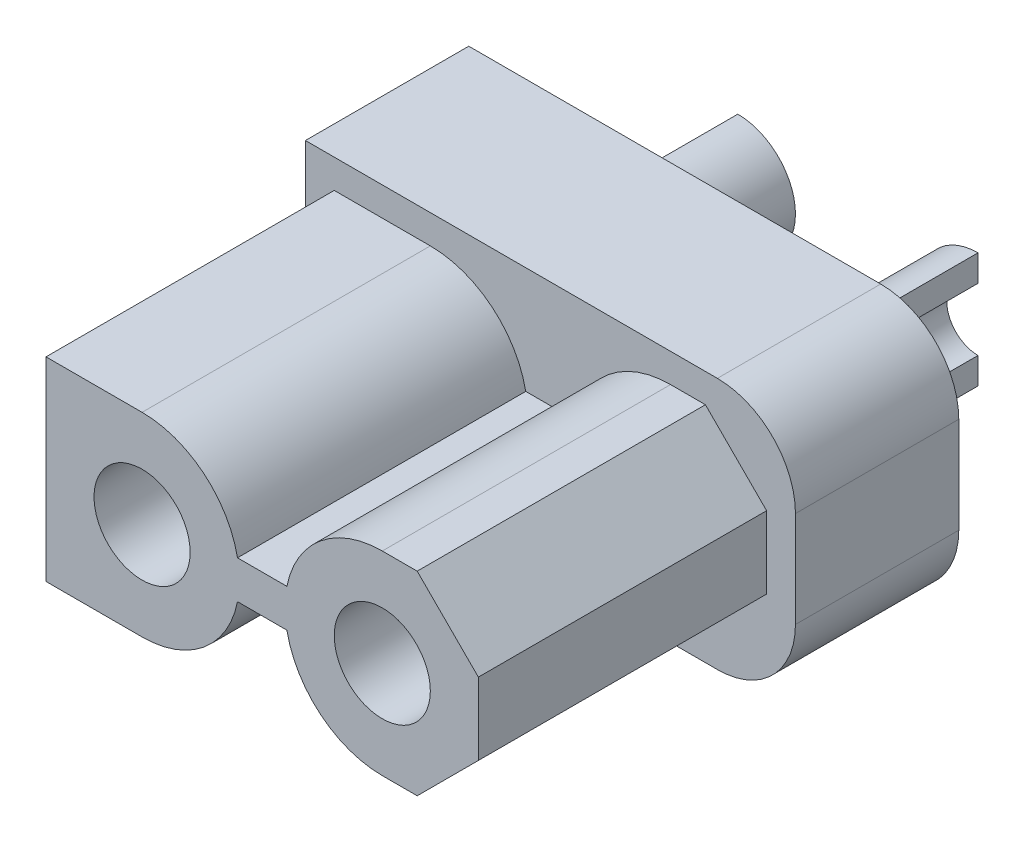
ISO-10303-21;
HEADER;
FILE_DESCRIPTION(('STEP AP214'),'2;1');
FILE_NAME('part.step','',(''),(''),'','','');
FILE_SCHEMA(('AUTOMOTIVE_DESIGN { 1 0 10303 214 1 1 1 1 }'));
ENDSEC;
DATA;
#1=APPLICATION_CONTEXT('core data for automotive mechanical design processes');
#2=APPLICATION_PROTOCOL_DEFINITION('international standard','automotive_design',2000,#1);
#3=PRODUCT_CONTEXT('',#1,'mechanical');
#4=PRODUCT('Part','Part','',(#3));
#5=PRODUCT_RELATED_PRODUCT_CATEGORY('part','',(#4));
#6=PRODUCT_DEFINITION_FORMATION('','',#4);
#7=PRODUCT_DEFINITION_CONTEXT('part definition',#1,'design');
#8=PRODUCT_DEFINITION('design','',#6,#7);
#9=PRODUCT_DEFINITION_SHAPE('','',#8);
#10=(LENGTH_UNIT() NAMED_UNIT(*) SI_UNIT(.MILLI.,.METRE.));
#11=(NAMED_UNIT(*) PLANE_ANGLE_UNIT() SI_UNIT($,.RADIAN.));
#12=(NAMED_UNIT(*) SI_UNIT($,.STERADIAN.) SOLID_ANGLE_UNIT());
#13=UNCERTAINTY_MEASURE_WITH_UNIT(LENGTH_MEASURE(1.E-05),#10,'distance_accuracy_value','');
#14=(GEOMETRIC_REPRESENTATION_CONTEXT(3) GLOBAL_UNCERTAINTY_ASSIGNED_CONTEXT((#13)) GLOBAL_UNIT_ASSIGNED_CONTEXT((#10,
#11,#12)) REPRESENTATION_CONTEXT('',''));
#15=CARTESIAN_POINT('',(0.,0.,0.));
#16=DIRECTION('',(0.,0.,1.));
#17=DIRECTION('',(1.,0.,0.));
#18=AXIS2_PLACEMENT_3D('',#15,#16,#17);
#19=CARTESIAN_POINT('',(2.6,0.,-9.39411254969543));
#20=DIRECTION('',(0.,0.,1.));
#21=DIRECTION('',(1.,0.,0.));
#22=AXIS2_PLACEMENT_3D('',#19,#20,#21);
#23=CYLINDRICAL_SURFACE('',#22,1.2);
#24=CARTESIAN_POINT('',(2.6,0.,0.));
#25=DIRECTION('',(0.,0.,1.));
#26=DIRECTION('',(1.,0.,0.));
#27=AXIS2_PLACEMENT_3D('',#24,#25,#26);
#28=CIRCLE('',#27,1.2);
#29=CARTESIAN_POINT('',(3.8,0.,0.));
#30=VERTEX_POINT('',#29);
#31=EDGE_CURVE('E373',#30,#30,#28,.T.);
#32=ORIENTED_EDGE('',*,*,#31,.F.);
#33=EDGE_LOOP('',(#32));
#34=FACE_BOUND('',#33,.T.);
#35=CARTESIAN_POINT('',(2.6,0.,-0.66));
#36=DIRECTION('',(0.,0.,-1.));
#37=DIRECTION('',(-1.,0.,0.));
#38=AXIS2_PLACEMENT_3D('',#35,#36,#37);
#39=CIRCLE('',#38,1.2);
#40=CARTESIAN_POINT('',(2.6,-1.2,-0.66));
#41=VERTEX_POINT('',#40);
#42=CARTESIAN_POINT('',(2.6,1.2,-0.66));
#43=VERTEX_POINT('',#42);
#44=EDGE_CURVE('E312',#41,#43,#39,.T.);
#45=ORIENTED_EDGE('',*,*,#44,.F.);
#46=DIRECTION('',(0.,0.,-1.));
#47=VECTOR('',#46,1.);
#48=CARTESIAN_POINT('',(2.6,-1.2,-0.66));
#49=LINE('',#48,#47);
#50=CARTESIAN_POINT('',(2.6,-1.2,-3.));
#51=VERTEX_POINT('',#50);
#52=EDGE_CURVE('E297',#41,#51,#49,.T.);
#53=ORIENTED_EDGE('',*,*,#52,.T.);
#54=CARTESIAN_POINT('',(2.6,0.,-3.));
#55=DIRECTION('',(0.,0.,1.));
#56=DIRECTION('',(1.,0.,0.));
#57=AXIS2_PLACEMENT_3D('',#54,#55,#56);
#58=CIRCLE('',#57,1.2);
#59=CARTESIAN_POINT('',(2.6,1.2,-3.));
#60=VERTEX_POINT('',#59);
#61=EDGE_CURVE('E364',#60,#51,#58,.F.);
#62=ORIENTED_EDGE('',*,*,#61,.F.);
#63=DIRECTION('',(0.,0.,-1.));
#64=VECTOR('',#63,1.);
#65=CARTESIAN_POINT('',(2.6,1.2,-0.66));
#66=LINE('',#65,#64);
#67=EDGE_CURVE('E308',#43,#60,#66,.T.);
#68=ORIENTED_EDGE('',*,*,#67,.F.);
#69=EDGE_LOOP('',(#45,#53,#62,#68));
#70=FACE_BOUND('',#69,.T.);
#71=ADVANCED_FACE('F111',(#34,#70),#23,.T.);
#72=CARTESIAN_POINT('',(0.,0.,-3.));
#73=DIRECTION('',(0.,0.,1.));
#74=DIRECTION('',(1.,0.,0.));
#75=AXIS2_PLACEMENT_3D('',#72,#73,#74);
#76=PLANE('',#75);
#77=DIRECTION('',(0.,1.,0.));
#78=VECTOR('',#77,1.);
#79=CARTESIAN_POINT('',(2.6,0.,-3.));
#80=LINE('',#79,#78);
#81=CARTESIAN_POINT('',(2.6,-0.65,-3.));
#82=VERTEX_POINT('',#81);
#83=EDGE_CURVE('E302',#51,#82,#80,.T.);
#84=ORIENTED_EDGE('',*,*,#83,.T.);
#85=CARTESIAN_POINT('',(2.6,0.,-3.));
#86=DIRECTION('',(0.,0.,-1.));
#87=DIRECTION('',(-1.,0.,0.));
#88=AXIS2_PLACEMENT_3D('',#85,#86,#87);
#89=CIRCLE('',#88,0.65);
#90=CARTESIAN_POINT('',(2.6,0.65,-3.));
#91=VERTEX_POINT('',#90);
#92=EDGE_CURVE('E332',#91,#82,#89,.T.);
#93=ORIENTED_EDGE('',*,*,#92,.F.);
#94=EDGE_CURVE('E317',#91,#60,#80,.T.);
#95=ORIENTED_EDGE('',*,*,#94,.T.);
#96=ORIENTED_EDGE('',*,*,#61,.T.);
#97=EDGE_LOOP('',(#84,#93,#95,#96));
#98=FACE_BOUND('',#97,.T.);
#99=ADVANCED_FACE('F670',(#98),#76,.F.);
#100=CARTESIAN_POINT('',(2.6,0.,1.83847763108502));
#101=DIRECTION('',(0.,0.,-1.));
#102=DIRECTION('',(-1.,0.,0.));
#103=AXIS2_PLACEMENT_3D('',#100,#101,#102);
#104=CYLINDRICAL_SURFACE('',#103,0.65);
#105=CARTESIAN_POINT('',(2.6,0.,0.));
#106=DIRECTION('',(0.,0.,1.));
#107=DIRECTION('',(1.,0.,0.));
#108=AXIS2_PLACEMENT_3D('',#105,#106,#107);
#109=CIRCLE('',#108,0.65);
#110=CARTESIAN_POINT('',(3.25,0.,0.));
#111=VERTEX_POINT('',#110);
#112=EDGE_CURVE('E360',#111,#111,#109,.F.);
#113=ORIENTED_EDGE('',*,*,#112,.F.);
#114=EDGE_LOOP('',(#113));
#115=FACE_BOUND('',#114,.T.);
#116=DIRECTION('',(0.,0.,-1.));
#117=VECTOR('',#116,1.);
#118=CARTESIAN_POINT('',(2.6,-0.65,-0.66));
#119=LINE('',#118,#117);
#120=CARTESIAN_POINT('',(2.6,-0.65,-0.66));
#121=VERTEX_POINT('',#120);
#122=EDGE_CURVE('E329',#121,#82,#119,.T.);
#123=ORIENTED_EDGE('',*,*,#122,.F.);
#124=CARTESIAN_POINT('',(2.6,0.,-0.66));
#125=DIRECTION('',(0.,0.,-1.));
#126=DIRECTION('',(-1.,0.,0.));
#127=AXIS2_PLACEMENT_3D('',#124,#125,#126);
#128=CIRCLE('',#127,0.65);
#129=CARTESIAN_POINT('',(2.6,0.65,-0.66));
#130=VERTEX_POINT('',#129);
#131=EDGE_CURVE('E309',#130,#121,#128,.F.);
#132=ORIENTED_EDGE('',*,*,#131,.F.);
#133=DIRECTION('',(0.,0.,-1.));
#134=VECTOR('',#133,1.);
#135=CARTESIAN_POINT('',(2.6,0.65,-0.66));
#136=LINE('',#135,#134);
#137=EDGE_CURVE('E333',#130,#91,#136,.T.);
#138=ORIENTED_EDGE('',*,*,#137,.T.);
#139=ORIENTED_EDGE('',*,*,#92,.T.);
#140=EDGE_LOOP('',(#123,#132,#138,#139));
#141=FACE_BOUND('',#140,.T.);
#142=ADVANCED_FACE('F676',(#115,#141),#104,.F.);
#143=CARTESIAN_POINT('',(0.,-2.625,3.4));
#144=DIRECTION('',(0.,1.,0.));
#145=DIRECTION('',(-1.,0.,0.));
#146=AXIS2_PLACEMENT_3D('',#143,#144,#145);
#147=PLANE('',#146);
#148=DIRECTION('',(1.,0.,0.));
#149=VECTOR('',#148,1.);
#150=CARTESIAN_POINT('',(0.,-2.625,0.));
#151=LINE('',#150,#149);
#152=CARTESIAN_POINT('',(0.,-2.625,0.));
#153=VERTEX_POINT('',#152);
#154=CARTESIAN_POINT('',(8.575,-2.625,0.));
#155=VERTEX_POINT('',#154);
#156=EDGE_CURVE('E447',#153,#155,#151,.T.);
#157=ORIENTED_EDGE('',*,*,#156,.T.);
#158=DIRECTION('',(0.,0.,-1.));
#159=VECTOR('',#158,1.);
#160=CARTESIAN_POINT('',(8.575,-2.625,3.4));
#161=LINE('',#160,#159);
#162=CARTESIAN_POINT('',(8.575,-2.625,3.4));
#163=VERTEX_POINT('',#162);
#164=EDGE_CURVE('E559',#163,#155,#161,.T.);
#165=ORIENTED_EDGE('',*,*,#164,.F.);
#166=DIRECTION('',(1.,0.,0.));
#167=VECTOR('',#166,1.);
#168=CARTESIAN_POINT('',(0.,-2.625,3.4));
#169=LINE('',#168,#167);
#170=CARTESIAN_POINT('',(0.,-2.625,3.4));
#171=VERTEX_POINT('',#170);
#172=EDGE_CURVE('E498',#171,#163,#169,.T.);
#173=ORIENTED_EDGE('',*,*,#172,.F.);
#174=DIRECTION('',(0.,0.,-1.));
#175=VECTOR('',#174,1.);
#176=CARTESIAN_POINT('',(0.,-2.625,3.4));
#177=LINE('',#176,#175);
#178=EDGE_CURVE('E522',#171,#153,#177,.T.);
#179=ORIENTED_EDGE('',*,*,#178,.T.);
#180=EDGE_LOOP('',(#157,#165,#173,#179));
#181=FACE_BOUND('',#180,.T.);
#182=ADVANCED_FACE('F113',(#181),#147,.F.);
#183=CARTESIAN_POINT('',(8.575,-1.,3.4));
#184=DIRECTION('',(0.,0.,-1.));
#185=DIRECTION('',(-1.,0.,0.));
#186=AXIS2_PLACEMENT_3D('',#183,#184,#185);
#187=CYLINDRICAL_SURFACE('',#186,1.62499999999999);
#188=CARTESIAN_POINT('',(8.575,-1.,0.));
#189=DIRECTION('',(0.,0.,1.));
#190=DIRECTION('',(1.,0.,0.));
#191=AXIS2_PLACEMENT_3D('',#188,#189,#190);
#192=CIRCLE('',#191,1.62499999999999);
#193=CARTESIAN_POINT('',(10.2,-1.,0.));
#194=VERTEX_POINT('',#193);
#195=EDGE_CURVE('E526',#155,#194,#192,.T.);
#196=ORIENTED_EDGE('',*,*,#195,.T.);
#197=DIRECTION('',(0.,0.,-1.));
#198=VECTOR('',#197,1.);
#199=CARTESIAN_POINT('',(10.2,-1.,3.4));
#200=LINE('',#199,#198);
#201=CARTESIAN_POINT('',(10.2,-1.,3.4));
#202=VERTEX_POINT('',#201);
#203=EDGE_CURVE('E556',#202,#194,#200,.T.);
#204=ORIENTED_EDGE('',*,*,#203,.F.);
#205=CARTESIAN_POINT('',(8.575,-1.,3.4));
#206=DIRECTION('',(0.,0.,1.));
#207=DIRECTION('',(1.,0.,0.));
#208=AXIS2_PLACEMENT_3D('',#205,#206,#207);
#209=CIRCLE('',#208,1.62499999999999);
#210=EDGE_CURVE('E502',#163,#202,#209,.T.);
#211=ORIENTED_EDGE('',*,*,#210,.F.);
#212=ORIENTED_EDGE('',*,*,#164,.T.);
#213=EDGE_LOOP('',(#196,#204,#211,#212));
#214=FACE_BOUND('',#213,.T.);
#215=ADVANCED_FACE('F765',(#214),#187,.T.);
#216=CARTESIAN_POINT('',(10.2,0.,3.4));
#217=DIRECTION('',(1.,0.,0.));
#218=DIRECTION('',(0.,0.,-1.));
#219=AXIS2_PLACEMENT_3D('',#216,#217,#218);
#220=PLANE('',#219);
#221=DIRECTION('',(0.,-1.,0.));
#222=VECTOR('',#221,1.);
#223=CARTESIAN_POINT('',(10.2,0.,0.));
#224=LINE('',#223,#222);
#225=CARTESIAN_POINT('',(10.2,1.,0.));
#226=VERTEX_POINT('',#225);
#227=EDGE_CURVE('E530',#226,#194,#224,.T.);
#228=ORIENTED_EDGE('',*,*,#227,.F.);
#229=DIRECTION('',(0.,0.,-1.));
#230=VECTOR('',#229,1.);
#231=CARTESIAN_POINT('',(10.2,1.,3.4));
#232=LINE('',#231,#230);
#233=CARTESIAN_POINT('',(10.2,1.,3.4));
#234=VERTEX_POINT('',#233);
#235=EDGE_CURVE('E553',#234,#226,#232,.T.);
#236=ORIENTED_EDGE('',*,*,#235,.F.);
#237=DIRECTION('',(0.,-1.,0.));
#238=VECTOR('',#237,1.);
#239=CARTESIAN_POINT('',(10.2,0.,3.4));
#240=LINE('',#239,#238);
#241=EDGE_CURVE('E506',#234,#202,#240,.T.);
#242=ORIENTED_EDGE('',*,*,#241,.T.);
#243=ORIENTED_EDGE('',*,*,#203,.T.);
#244=EDGE_LOOP('',(#228,#236,#242,#243));
#245=FACE_BOUND('',#244,.T.);
#246=ADVANCED_FACE('F762',(#245),#220,.T.);
#247=CARTESIAN_POINT('',(8.575,1.,3.4));
#248=DIRECTION('',(0.,0.,-1.));
#249=DIRECTION('',(-1.,0.,0.));
#250=AXIS2_PLACEMENT_3D('',#247,#248,#249);
#251=CYLINDRICAL_SURFACE('',#250,1.62499999999999);
#252=CARTESIAN_POINT('',(8.575,1.,0.));
#253=DIRECTION('',(0.,0.,1.));
#254=DIRECTION('',(1.,0.,0.));
#255=AXIS2_PLACEMENT_3D('',#252,#253,#254);
#256=CIRCLE('',#255,1.62499999999999);
#257=CARTESIAN_POINT('',(8.575,2.625,0.));
#258=VERTEX_POINT('',#257);
#259=EDGE_CURVE('E534',#258,#226,#256,.F.);
#260=ORIENTED_EDGE('',*,*,#259,.F.);
#261=DIRECTION('',(0.,0.,-1.));
#262=VECTOR('',#261,1.);
#263=CARTESIAN_POINT('',(8.575,2.625,3.4));
#264=LINE('',#263,#262);
#265=CARTESIAN_POINT('',(8.575,2.625,3.4));
#266=VERTEX_POINT('',#265);
#267=EDGE_CURVE('E550',#266,#258,#264,.T.);
#268=ORIENTED_EDGE('',*,*,#267,.F.);
#269=CARTESIAN_POINT('',(8.575,1.,3.4));
#270=DIRECTION('',(0.,0.,1.));
#271=DIRECTION('',(1.,0.,0.));
#272=AXIS2_PLACEMENT_3D('',#269,#270,#271);
#273=CIRCLE('',#272,1.62499999999999);
#274=EDGE_CURVE('E510',#266,#234,#273,.F.);
#275=ORIENTED_EDGE('',*,*,#274,.T.);
#276=ORIENTED_EDGE('',*,*,#235,.T.);
#277=EDGE_LOOP('',(#260,#268,#275,#276));
#278=FACE_BOUND('',#277,.T.);
#279=ADVANCED_FACE('F758',(#278),#251,.T.);
#280=CARTESIAN_POINT('',(0.,2.625,3.4));
#281=DIRECTION('',(0.,1.,0.));
#282=DIRECTION('',(-1.,0.,0.));
#283=AXIS2_PLACEMENT_3D('',#280,#281,#282);
#284=PLANE('',#283);
#285=DIRECTION('',(1.,0.,0.));
#286=VECTOR('',#285,1.);
#287=CARTESIAN_POINT('',(0.,2.625,0.));
#288=LINE('',#287,#286);
#289=CARTESIAN_POINT('',(0.,2.625,0.));
#290=VERTEX_POINT('',#289);
#291=EDGE_CURVE('E538',#290,#258,#288,.T.);
#292=ORIENTED_EDGE('',*,*,#291,.F.);
#293=DIRECTION('',(0.,0.,-1.));
#294=VECTOR('',#293,1.);
#295=CARTESIAN_POINT('',(0.,2.625,3.4));
#296=LINE('',#295,#294);
#297=CARTESIAN_POINT('',(0.,2.625,3.4));
#298=VERTEX_POINT('',#297);
#299=EDGE_CURVE('E547',#298,#290,#296,.T.);
#300=ORIENTED_EDGE('',*,*,#299,.F.);
#301=DIRECTION('',(1.,0.,0.));
#302=VECTOR('',#301,1.);
#303=CARTESIAN_POINT('',(0.,2.625,3.4));
#304=LINE('',#303,#302);
#305=EDGE_CURVE('E514',#298,#266,#304,.T.);
#306=ORIENTED_EDGE('',*,*,#305,.T.);
#307=ORIENTED_EDGE('',*,*,#267,.T.);
#308=EDGE_LOOP('',(#292,#300,#306,#307));
#309=FACE_BOUND('',#308,.T.);
#310=ADVANCED_FACE('F754',(#309),#284,.T.);
#311=CARTESIAN_POINT('',(0.,0.,3.4));
#312=DIRECTION('',(-1.,0.,0.));
#313=DIRECTION('',(0.,0.,1.));
#314=AXIS2_PLACEMENT_3D('',#311,#312,#313);
#315=PLANE('',#314);
#316=DIRECTION('',(0.,1.,0.));
#317=VECTOR('',#316,1.);
#318=CARTESIAN_POINT('',(0.,0.,0.));
#319=LINE('',#318,#317);
#320=EDGE_CURVE('E503',#153,#290,#319,.T.);
#321=ORIENTED_EDGE('',*,*,#320,.F.);
#322=ORIENTED_EDGE('',*,*,#178,.F.);
#323=DIRECTION('',(0.,1.,0.));
#324=VECTOR('',#323,1.);
#325=CARTESIAN_POINT('',(0.,0.,3.4));
#326=LINE('',#325,#324);
#327=EDGE_CURVE('E518',#171,#298,#326,.T.);
#328=ORIENTED_EDGE('',*,*,#327,.T.);
#329=ORIENTED_EDGE('',*,*,#299,.T.);
#330=EDGE_LOOP('',(#321,#322,#328,#329));
#331=FACE_BOUND('',#330,.T.);
#332=ADVANCED_FACE('F747',(#331),#315,.T.);
#333=CARTESIAN_POINT('',(0.,0.,3.4));
#334=DIRECTION('',(0.,0.,1.));
#335=DIRECTION('',(1.,0.,0.));
#336=AXIS2_PLACEMENT_3D('',#333,#334,#335);
#337=PLANE('',#336);
#338=DIRECTION('',(-0.707106781186547,0.707106781186549,0.));
#339=VECTOR('',#338,1.);
#340=CARTESIAN_POINT('',(5.17573593128809,5.17573593128807,3.4));
#341=LINE('',#340,#339);
#342=CARTESIAN_POINT('',(9.6,0.751471862576143,3.4));
#343=VERTEX_POINT('',#342);
#344=CARTESIAN_POINT('',(8.32647186257615,2.025,3.4));
#345=VERTEX_POINT('',#344);
#346=EDGE_CURVE('E614',#343,#345,#341,.T.);
#347=ORIENTED_EDGE('',*,*,#346,.F.);
#348=DIRECTION('',(0.,1.,0.));
#349=VECTOR('',#348,1.);
#350=CARTESIAN_POINT('',(9.6,0.,3.4));
#351=LINE('',#350,#349);
#352=CARTESIAN_POINT('',(9.6,-0.751471862576143,3.4));
#353=VERTEX_POINT('',#352);
#354=EDGE_CURVE('E599',#353,#343,#351,.T.);
#355=ORIENTED_EDGE('',*,*,#354,.F.);
#356=DIRECTION('',(0.707106781186546,0.707106781186549,0.));
#357=VECTOR('',#356,1.);
#358=CARTESIAN_POINT('',(5.17573593128809,-5.17573593128807,3.4));
#359=LINE('',#358,#357);
#360=CARTESIAN_POINT('',(8.32647186257615,-2.025,3.4));
#361=VERTEX_POINT('',#360);
#362=EDGE_CURVE('E591',#361,#353,#359,.T.);
#363=ORIENTED_EDGE('',*,*,#362,.F.);
#364=DIRECTION('',(1.,0.,0.));
#365=VECTOR('',#364,1.);
#366=CARTESIAN_POINT('',(0.,-2.025,3.4));
#367=LINE('',#366,#365);
#368=CARTESIAN_POINT('',(7.6,-2.025,3.4));
#369=VERTEX_POINT('',#368);
#370=EDGE_CURVE('E587',#369,#361,#367,.T.);
#371=ORIENTED_EDGE('',*,*,#370,.F.);
#372=CARTESIAN_POINT('',(7.6,0.,3.4));
#373=DIRECTION('',(0.,0.,1.));
#374=DIRECTION('',(1.,0.,0.));
#375=AXIS2_PLACEMENT_3D('',#372,#373,#374);
#376=CIRCLE('',#375,2.025);
#377=CARTESIAN_POINT('',(5.61389829062054,-0.395,3.4));
#378=VERTEX_POINT('',#377);
#379=EDGE_CURVE('E583',#378,#369,#376,.T.);
#380=ORIENTED_EDGE('',*,*,#379,.F.);
#381=DIRECTION('',(1.,0.,0.));
#382=VECTOR('',#381,1.);
#383=CARTESIAN_POINT('',(0.,-0.395,3.4));
#384=LINE('',#383,#382);
#385=CARTESIAN_POINT('',(4.58610170937946,-0.395,3.4));
#386=VERTEX_POINT('',#385);
#387=EDGE_CURVE('E563',#386,#378,#384,.T.);
#388=ORIENTED_EDGE('',*,*,#387,.F.);
#389=CARTESIAN_POINT('',(2.6,0.,3.4));
#390=DIRECTION('',(0.,0.,1.));
#391=DIRECTION('',(1.,0.,0.));
#392=AXIS2_PLACEMENT_3D('',#389,#390,#391);
#393=CIRCLE('',#392,2.025);
#394=CARTESIAN_POINT('',(2.6,-2.025,3.4));
#395=VERTEX_POINT('',#394);
#396=EDGE_CURVE('E567',#395,#386,#393,.T.);
#397=ORIENTED_EDGE('',*,*,#396,.F.);
#398=DIRECTION('',(1.,0.,0.));
#399=VECTOR('',#398,1.);
#400=CARTESIAN_POINT('',(0.,-2.025,3.4));
#401=LINE('',#400,#399);
#402=CARTESIAN_POINT('',(0.6,-2.025,3.4));
#403=VERTEX_POINT('',#402);
#404=EDGE_CURVE('E571',#403,#395,#401,.T.);
#405=ORIENTED_EDGE('',*,*,#404,.F.);
#406=DIRECTION('',(0.,-1.,0.));
#407=VECTOR('',#406,1.);
#408=CARTESIAN_POINT('',(0.6,0.,3.4));
#409=LINE('',#408,#407);
#410=CARTESIAN_POINT('',(0.6,2.025,3.4));
#411=VERTEX_POINT('',#410);
#412=EDGE_CURVE('E575',#411,#403,#409,.T.);
#413=ORIENTED_EDGE('',*,*,#412,.F.);
#414=DIRECTION('',(-1.,0.,0.));
#415=VECTOR('',#414,1.);
#416=CARTESIAN_POINT('',(0.,2.025,3.4));
#417=LINE('',#416,#415);
#418=CARTESIAN_POINT('',(2.6,2.025,3.4));
#419=VERTEX_POINT('',#418);
#420=EDGE_CURVE('E579',#419,#411,#417,.T.);
#421=ORIENTED_EDGE('',*,*,#420,.F.);
#422=CARTESIAN_POINT('',(2.6,0.,3.4));
#423=DIRECTION('',(0.,0.,1.));
#424=DIRECTION('',(1.,0.,0.));
#425=AXIS2_PLACEMENT_3D('',#422,#423,#424);
#426=CIRCLE('',#425,2.025);
#427=CARTESIAN_POINT('',(4.58610170937946,0.395,3.4));
#428=VERTEX_POINT('',#427);
#429=EDGE_CURVE('E595',#428,#419,#426,.T.);
#430=ORIENTED_EDGE('',*,*,#429,.F.);
#431=DIRECTION('',(1.,0.,0.));
#432=VECTOR('',#431,1.);
#433=CARTESIAN_POINT('',(0.,0.395,3.4));
#434=LINE('',#433,#432);
#435=CARTESIAN_POINT('',(5.61389829062054,0.395,3.4));
#436=VERTEX_POINT('',#435);
#437=EDGE_CURVE('E603',#428,#436,#434,.T.);
#438=ORIENTED_EDGE('',*,*,#437,.T.);
#439=CARTESIAN_POINT('',(7.6,0.,3.4));
#440=DIRECTION('',(0.,0.,1.));
#441=DIRECTION('',(1.,0.,0.));
#442=AXIS2_PLACEMENT_3D('',#439,#440,#441);
#443=CIRCLE('',#442,2.025);
#444=CARTESIAN_POINT('',(7.6,2.025,3.4));
#445=VERTEX_POINT('',#444);
#446=EDGE_CURVE('E606',#445,#436,#443,.T.);
#447=ORIENTED_EDGE('',*,*,#446,.F.);
#448=DIRECTION('',(-1.,0.,0.));
#449=VECTOR('',#448,1.);
#450=CARTESIAN_POINT('',(0.,2.025,3.4));
#451=LINE('',#450,#449);
#452=EDGE_CURVE('E610',#345,#445,#451,.T.);
#453=ORIENTED_EDGE('',*,*,#452,.F.);
#454=EDGE_LOOP('',(#347,#355,#363,#371,#380,#388,#397,#405,#413,#421,#430,#438,#447,#453));
#455=FACE_BOUND('',#454,.T.);
#456=ORIENTED_EDGE('',*,*,#172,.T.);
#457=ORIENTED_EDGE('',*,*,#210,.T.);
#458=ORIENTED_EDGE('',*,*,#241,.F.);
#459=ORIENTED_EDGE('',*,*,#274,.F.);
#460=ORIENTED_EDGE('',*,*,#305,.F.);
#461=ORIENTED_EDGE('',*,*,#327,.F.);
#462=EDGE_LOOP('',(#456,#457,#458,#459,#460,#461));
#463=FACE_BOUND('',#462,.T.);
#464=ADVANCED_FACE('F744',(#455,#463),#337,.T.);
#465=CARTESIAN_POINT('',(0.,0.,0.));
#466=DIRECTION('',(0.,0.,1.));
#467=DIRECTION('',(1.,0.,0.));
#468=AXIS2_PLACEMENT_3D('',#465,#466,#467);
#469=PLANE('',#468);
#470=ORIENTED_EDGE('',*,*,#31,.T.);
#471=EDGE_LOOP('',(#470));
#472=FACE_BOUND('',#471,.T.);
#473=CARTESIAN_POINT('',(7.6,0.,0.));
#474=DIRECTION('',(0.,0.,1.));
#475=DIRECTION('',(1.,0.,0.));
#476=AXIS2_PLACEMENT_3D('',#473,#474,#475);
#477=CIRCLE('',#476,1.2);
#478=CARTESIAN_POINT('',(8.8,0.,0.));
#479=VERTEX_POINT('',#478);
#480=EDGE_CURVE('E381',#479,#479,#477,.T.);
#481=ORIENTED_EDGE('',*,*,#480,.T.);
#482=EDGE_LOOP('',(#481));
#483=FACE_BOUND('',#482,.T.);
#484=ORIENTED_EDGE('',*,*,#156,.F.);
#485=ORIENTED_EDGE('',*,*,#320,.T.);
#486=ORIENTED_EDGE('',*,*,#291,.T.);
#487=ORIENTED_EDGE('',*,*,#259,.T.);
#488=ORIENTED_EDGE('',*,*,#227,.T.);
#489=ORIENTED_EDGE('',*,*,#195,.F.);
#490=EDGE_LOOP('',(#484,#485,#486,#487,#488,#489));
#491=FACE_BOUND('',#490,.T.);
#492=ADVANCED_FACE('F707',(#472,#483,#491),#469,.F.);
#493=CARTESIAN_POINT('',(5.17573593128809,-5.17573593128807,24.4825616439699));
#494=DIRECTION('',(0.707106781186549,-0.707106781186546,0.));
#495=DIRECTION('',(0.707106781186546,0.707106781186549,0.));
#496=AXIS2_PLACEMENT_3D('',#493,#494,#495);
#497=PLANE('',#496);
#498=DIRECTION('',(0.,0.,-1.));
#499=VECTOR('',#498,1.);
#500=CARTESIAN_POINT('',(8.32647186257615,-2.025,24.4825616439699));
#501=LINE('',#500,#499);
#502=CARTESIAN_POINT('',(8.32647186257615,-2.025,9.4));
#503=VERTEX_POINT('',#502);
#504=EDGE_CURVE('E402',#503,#361,#501,.T.);
#505=ORIENTED_EDGE('',*,*,#504,.T.);
#506=ORIENTED_EDGE('',*,*,#362,.T.);
#507=DIRECTION('',(0.,0.,-1.));
#508=VECTOR('',#507,1.);
#509=CARTESIAN_POINT('',(9.6,-0.751471862576144,24.4825616439699));
#510=LINE('',#509,#508);
#511=CARTESIAN_POINT('',(9.6,-0.751471862576144,9.4));
#512=VERTEX_POINT('',#511);
#513=EDGE_CURVE('E407',#512,#353,#510,.T.);
#514=ORIENTED_EDGE('',*,*,#513,.F.);
#515=DIRECTION('',(-0.707106781186546,-0.707106781186549,0.));
#516=VECTOR('',#515,1.);
#517=CARTESIAN_POINT('',(5.17573593128809,-5.17573593128807,9.4));
#518=LINE('',#517,#516);
#519=EDGE_CURVE('E403',#512,#503,#518,.T.);
#520=ORIENTED_EDGE('',*,*,#519,.T.);
#521=EDGE_LOOP('',(#505,#506,#514,#520));
#522=FACE_BOUND('',#521,.T.);
#523=ADVANCED_FACE('F703',(#522),#497,.T.);
#524=CARTESIAN_POINT('',(9.6,0.,24.4825616439699));
#525=DIRECTION('',(1.,0.,0.));
#526=DIRECTION('',(0.,0.,-1.));
#527=AXIS2_PLACEMENT_3D('',#524,#525,#526);
#528=PLANE('',#527);
#529=ORIENTED_EDGE('',*,*,#513,.T.);
#530=ORIENTED_EDGE('',*,*,#354,.T.);
#531=DIRECTION('',(0.,0.,-1.));
#532=VECTOR('',#531,1.);
#533=CARTESIAN_POINT('',(9.6,0.751471862576143,24.4825616439699));
#534=LINE('',#533,#532);
#535=CARTESIAN_POINT('',(9.6,0.751471862576145,9.4));
#536=VERTEX_POINT('',#535);
#537=EDGE_CURVE('E412',#536,#343,#534,.T.);
#538=ORIENTED_EDGE('',*,*,#537,.F.);
#539=DIRECTION('',(0.,-1.,0.));
#540=VECTOR('',#539,1.);
#541=CARTESIAN_POINT('',(9.6,0.,9.4));
#542=LINE('',#541,#540);
#543=EDGE_CURVE('E408',#536,#512,#542,.T.);
#544=ORIENTED_EDGE('',*,*,#543,.T.);
#545=EDGE_LOOP('',(#529,#530,#538,#544));
#546=FACE_BOUND('',#545,.T.);
#547=ADVANCED_FACE('F706',(#546),#528,.T.);
#548=CARTESIAN_POINT('',(5.17573593128809,5.17573593128807,24.4825616439699));
#549=DIRECTION('',(0.707106781186549,0.707106781186547,0.));
#550=DIRECTION('',(-0.707106781186547,0.707106781186549,0.));
#551=AXIS2_PLACEMENT_3D('',#548,#549,#550);
#552=PLANE('',#551);
#553=ORIENTED_EDGE('',*,*,#537,.T.);
#554=ORIENTED_EDGE('',*,*,#346,.T.);
#555=DIRECTION('',(0.,0.,-1.));
#556=VECTOR('',#555,1.);
#557=CARTESIAN_POINT('',(8.32647186257615,2.025,24.4825616439699));
#558=LINE('',#557,#556);
#559=CARTESIAN_POINT('',(8.32647186257615,2.025,9.4));
#560=VERTEX_POINT('',#559);
#561=EDGE_CURVE('E417',#560,#345,#558,.T.);
#562=ORIENTED_EDGE('',*,*,#561,.F.);
#563=DIRECTION('',(0.707106781186547,-0.707106781186549,0.));
#564=VECTOR('',#563,1.);
#565=CARTESIAN_POINT('',(5.17573593128809,5.17573593128807,9.4));
#566=LINE('',#565,#564);
#567=EDGE_CURVE('E413',#560,#536,#566,.T.);
#568=ORIENTED_EDGE('',*,*,#567,.T.);
#569=EDGE_LOOP('',(#553,#554,#562,#568));
#570=FACE_BOUND('',#569,.T.);
#571=ADVANCED_FACE('F711',(#570),#552,.T.);
#572=CARTESIAN_POINT('',(0.,2.025,24.4825616439699));
#573=DIRECTION('',(0.,1.,0.));
#574=DIRECTION('',(-1.,0.,0.));
#575=AXIS2_PLACEMENT_3D('',#572,#573,#574);
#576=PLANE('',#575);
#577=ORIENTED_EDGE('',*,*,#561,.T.);
#578=ORIENTED_EDGE('',*,*,#452,.T.);
#579=DIRECTION('',(0.,0.,-1.));
#580=VECTOR('',#579,1.);
#581=CARTESIAN_POINT('',(7.6,2.025,24.4825616439699));
#582=LINE('',#581,#580);
#583=CARTESIAN_POINT('',(7.6,2.025,9.4));
#584=VERTEX_POINT('',#583);
#585=EDGE_CURVE('E390',#584,#445,#582,.T.);
#586=ORIENTED_EDGE('',*,*,#585,.F.);
#587=DIRECTION('',(1.,0.,0.));
#588=VECTOR('',#587,1.);
#589=CARTESIAN_POINT('',(0.,2.025,9.4));
#590=LINE('',#589,#588);
#591=EDGE_CURVE('E418',#584,#560,#590,.T.);
#592=ORIENTED_EDGE('',*,*,#591,.T.);
#593=EDGE_LOOP('',(#577,#578,#586,#592));
#594=FACE_BOUND('',#593,.T.);
#595=ADVANCED_FACE('F715',(#594),#576,.T.);
#596=CARTESIAN_POINT('',(7.6,0.,24.4825616439699));
#597=DIRECTION('',(0.,0.,-1.));
#598=DIRECTION('',(-1.,0.,0.));
#599=AXIS2_PLACEMENT_3D('',#596,#597,#598);
#600=CYLINDRICAL_SURFACE('',#599,2.025);
#601=ORIENTED_EDGE('',*,*,#585,.T.);
#602=ORIENTED_EDGE('',*,*,#446,.T.);
#603=DIRECTION('',(0.,0.,-1.));
#604=VECTOR('',#603,1.);
#605=CARTESIAN_POINT('',(5.61389829062054,0.395,24.4825616439699));
#606=LINE('',#605,#604);
#607=CARTESIAN_POINT('',(5.61389829062054,0.395,9.4));
#608=VERTEX_POINT('',#607);
#609=EDGE_CURVE('E425',#608,#436,#606,.T.);
#610=ORIENTED_EDGE('',*,*,#609,.F.);
#611=CARTESIAN_POINT('',(7.6,0.,9.4));
#612=DIRECTION('',(0.,0.,1.));
#613=DIRECTION('',(1.,0.,0.));
#614=AXIS2_PLACEMENT_3D('',#611,#612,#613);
#615=CIRCLE('',#614,2.025);
#616=EDGE_CURVE('E386',#608,#584,#615,.F.);
#617=ORIENTED_EDGE('',*,*,#616,.T.);
#618=EDGE_LOOP('',(#601,#602,#610,#617));
#619=FACE_BOUND('',#618,.T.);
#620=ADVANCED_FACE('F697',(#619),#600,.T.);
#621=CARTESIAN_POINT('',(0.,0.,9.4));
#622=DIRECTION('',(0.,0.,1.));
#623=DIRECTION('',(1.,0.,0.));
#624=AXIS2_PLACEMENT_3D('',#621,#622,#623);
#625=PLANE('',#624);
#626=CARTESIAN_POINT('',(7.6,0.,9.4));
#627=DIRECTION('',(0.,0.,1.));
#628=DIRECTION('',(1.,0.,0.));
#629=AXIS2_PLACEMENT_3D('',#626,#627,#628);
#630=CIRCLE('',#629,1.);
#631=CARTESIAN_POINT('',(8.6,0.,9.4));
#632=VERTEX_POINT('',#631);
#633=EDGE_CURVE('E639',#632,#632,#630,.T.);
#634=ORIENTED_EDGE('',*,*,#633,.F.);
#635=EDGE_LOOP('',(#634));
#636=FACE_BOUND('',#635,.T.);
#637=CARTESIAN_POINT('',(2.6,0.,9.4));
#638=DIRECTION('',(0.,0.,1.));
#639=DIRECTION('',(1.,0.,0.));
#640=AXIS2_PLACEMENT_3D('',#637,#638,#639);
#641=CIRCLE('',#640,1.);
#642=CARTESIAN_POINT('',(3.6,0.,9.4));
#643=VERTEX_POINT('',#642);
#644=EDGE_CURVE('E648',#643,#643,#641,.T.);
#645=ORIENTED_EDGE('',*,*,#644,.F.);
#646=EDGE_LOOP('',(#645));
#647=FACE_BOUND('',#646,.T.);
#648=ORIENTED_EDGE('',*,*,#616,.F.);
#649=DIRECTION('',(-1.,0.,0.));
#650=VECTOR('',#649,1.);
#651=CARTESIAN_POINT('',(5.61389829062054,0.395,9.4));
#652=LINE('',#651,#650);
#653=CARTESIAN_POINT('',(4.58610170937946,0.395,9.4));
#654=VERTEX_POINT('',#653);
#655=EDGE_CURVE('E385',#608,#654,#652,.T.);
#656=ORIENTED_EDGE('',*,*,#655,.T.);
#657=CARTESIAN_POINT('',(2.6,0.,9.4));
#658=DIRECTION('',(0.,0.,1.));
#659=DIRECTION('',(1.,0.,0.));
#660=AXIS2_PLACEMENT_3D('',#657,#658,#659);
#661=CIRCLE('',#660,2.025);
#662=CARTESIAN_POINT('',(2.6,2.025,9.4));
#663=VERTEX_POINT('',#662);
#664=EDGE_CURVE('E469',#663,#654,#661,.F.);
#665=ORIENTED_EDGE('',*,*,#664,.F.);
#666=DIRECTION('',(1.,0.,0.));
#667=VECTOR('',#666,1.);
#668=CARTESIAN_POINT('',(0.,2.025,9.4));
#669=LINE('',#668,#667);
#670=CARTESIAN_POINT('',(0.6,2.025,9.4));
#671=VERTEX_POINT('',#670);
#672=EDGE_CURVE('E448',#671,#663,#669,.T.);
#673=ORIENTED_EDGE('',*,*,#672,.F.);
#674=DIRECTION('',(0.,1.,0.));
#675=VECTOR('',#674,1.);
#676=CARTESIAN_POINT('',(0.6,0.,9.4));
#677=LINE('',#676,#675);
#678=CARTESIAN_POINT('',(0.6,-2.025,9.4));
#679=VERTEX_POINT('',#678);
#680=EDGE_CURVE('E454',#679,#671,#677,.T.);
#681=ORIENTED_EDGE('',*,*,#680,.F.);
#682=DIRECTION('',(-1.,0.,0.));
#683=VECTOR('',#682,1.);
#684=CARTESIAN_POINT('',(0.,-2.025,9.4));
#685=LINE('',#684,#683);
#686=CARTESIAN_POINT('',(2.6,-2.025,9.4));
#687=VERTEX_POINT('',#686);
#688=EDGE_CURVE('E459',#687,#679,#685,.T.);
#689=ORIENTED_EDGE('',*,*,#688,.F.);
#690=CARTESIAN_POINT('',(2.6,0.,9.4));
#691=DIRECTION('',(0.,0.,1.));
#692=DIRECTION('',(1.,0.,0.));
#693=AXIS2_PLACEMENT_3D('',#690,#691,#692);
#694=CIRCLE('',#693,2.025);
#695=CARTESIAN_POINT('',(4.58610170937946,-0.395,9.4));
#696=VERTEX_POINT('',#695);
#697=EDGE_CURVE('E464',#696,#687,#694,.F.);
#698=ORIENTED_EDGE('',*,*,#697,.F.);
#699=DIRECTION('',(-1.,0.,0.));
#700=VECTOR('',#699,1.);
#701=CARTESIAN_POINT('',(5.61389829062054,-0.395,9.4));
#702=LINE('',#701,#700);
#703=CARTESIAN_POINT('',(5.61389829062054,-0.395,9.4));
#704=VERTEX_POINT('',#703);
#705=EDGE_CURVE('E453',#704,#696,#702,.T.);
#706=ORIENTED_EDGE('',*,*,#705,.F.);
#707=CARTESIAN_POINT('',(7.6,0.,9.4));
#708=DIRECTION('',(0.,0.,1.));
#709=DIRECTION('',(1.,0.,0.));
#710=AXIS2_PLACEMENT_3D('',#707,#708,#709);
#711=CIRCLE('',#710,2.025);
#712=CARTESIAN_POINT('',(7.6,-2.025,9.4));
#713=VERTEX_POINT('',#712);
#714=EDGE_CURVE('E392',#713,#704,#711,.F.);
#715=ORIENTED_EDGE('',*,*,#714,.F.);
#716=DIRECTION('',(-1.,0.,0.));
#717=VECTOR('',#716,1.);
#718=CARTESIAN_POINT('',(0.,-2.025,9.4));
#719=LINE('',#718,#717);
#720=EDGE_CURVE('E398',#503,#713,#719,.T.);
#721=ORIENTED_EDGE('',*,*,#720,.F.);
#722=ORIENTED_EDGE('',*,*,#519,.F.);
#723=ORIENTED_EDGE('',*,*,#543,.F.);
#724=ORIENTED_EDGE('',*,*,#567,.F.);
#725=ORIENTED_EDGE('',*,*,#591,.F.);
#726=EDGE_LOOP('',(#648,#656,#665,#673,#681,#689,#698,#706,#715,#721,#722,#723,#724,#725));
#727=FACE_BOUND('',#726,.T.);
#728=ADVANCED_FACE('F701',(#636,#647,#727),#625,.T.);
#729=CARTESIAN_POINT('',(0.,-2.025,24.4825616439699));
#730=DIRECTION('',(0.,-1.,0.));
#731=DIRECTION('',(1.,0.,0.));
#732=AXIS2_PLACEMENT_3D('',#729,#730,#731);
#733=PLANE('',#732);
#734=DIRECTION('',(0.,0.,-1.));
#735=VECTOR('',#734,1.);
#736=CARTESIAN_POINT('',(7.6,-2.025,24.4825616439699));
#737=LINE('',#736,#735);
#738=EDGE_CURVE('E397',#713,#369,#737,.T.);
#739=ORIENTED_EDGE('',*,*,#738,.T.);
#740=ORIENTED_EDGE('',*,*,#370,.T.);
#741=ORIENTED_EDGE('',*,*,#504,.F.);
#742=ORIENTED_EDGE('',*,*,#720,.T.);
#743=EDGE_LOOP('',(#739,#740,#741,#742));
#744=FACE_BOUND('',#743,.T.);
#745=ADVANCED_FACE('F695',(#744),#733,.T.);
#746=DIRECTION('',(0.,0.,-1.));
#747=VECTOR('',#746,1.);
#748=CARTESIAN_POINT('',(5.61389829062054,-0.395,24.4825616439699));
#749=LINE('',#748,#747);
#750=EDGE_CURVE('E396',#704,#378,#749,.T.);
#751=ORIENTED_EDGE('',*,*,#750,.T.);
#752=ORIENTED_EDGE('',*,*,#379,.T.);
#753=ORIENTED_EDGE('',*,*,#738,.F.);
#754=ORIENTED_EDGE('',*,*,#714,.T.);
#755=EDGE_LOOP('',(#751,#752,#753,#754));
#756=FACE_BOUND('',#755,.T.);
#757=ADVANCED_FACE('F691',(#756),#600,.T.);
#758=CARTESIAN_POINT('',(0.,2.025,24.4825616439699));
#759=DIRECTION('',(0.,1.,0.));
#760=DIRECTION('',(-1.,0.,0.));
#761=AXIS2_PLACEMENT_3D('',#758,#759,#760);
#762=PLANE('',#761);
#763=DIRECTION('',(0.,0.,-1.));
#764=VECTOR('',#763,1.);
#765=CARTESIAN_POINT('',(2.6,2.025,24.4825616439699));
#766=LINE('',#765,#764);
#767=EDGE_CURVE('E452',#663,#419,#766,.T.);
#768=ORIENTED_EDGE('',*,*,#767,.T.);
#769=ORIENTED_EDGE('',*,*,#420,.T.);
#770=DIRECTION('',(0.,0.,-1.));
#771=VECTOR('',#770,1.);
#772=CARTESIAN_POINT('',(0.6,2.025,24.4825616439699));
#773=LINE('',#772,#771);
#774=EDGE_CURVE('E391',#671,#411,#773,.T.);
#775=ORIENTED_EDGE('',*,*,#774,.F.);
#776=ORIENTED_EDGE('',*,*,#672,.T.);
#777=EDGE_LOOP('',(#768,#769,#775,#776));
#778=FACE_BOUND('',#777,.T.);
#779=ADVANCED_FACE('F694',(#778),#762,.T.);
#780=CARTESIAN_POINT('',(0.6,0.,24.4825616439699));
#781=DIRECTION('',(-1.,0.,0.));
#782=DIRECTION('',(0.,0.,1.));
#783=AXIS2_PLACEMENT_3D('',#780,#781,#782);
#784=PLANE('',#783);
#785=ORIENTED_EDGE('',*,*,#774,.T.);
#786=ORIENTED_EDGE('',*,*,#412,.T.);
#787=DIRECTION('',(0.,0.,-1.));
#788=VECTOR('',#787,1.);
#789=CARTESIAN_POINT('',(0.6,-2.025,24.4825616439699));
#790=LINE('',#789,#788);
#791=EDGE_CURVE('E458',#679,#403,#790,.T.);
#792=ORIENTED_EDGE('',*,*,#791,.F.);
#793=ORIENTED_EDGE('',*,*,#680,.T.);
#794=EDGE_LOOP('',(#785,#786,#792,#793));
#795=FACE_BOUND('',#794,.T.);
#796=ADVANCED_FACE('F723',(#795),#784,.T.);
#797=CARTESIAN_POINT('',(0.,-2.025,24.4825616439699));
#798=DIRECTION('',(0.,-1.,0.));
#799=DIRECTION('',(1.,0.,0.));
#800=AXIS2_PLACEMENT_3D('',#797,#798,#799);
#801=PLANE('',#800);
#802=ORIENTED_EDGE('',*,*,#791,.T.);
#803=ORIENTED_EDGE('',*,*,#404,.T.);
#804=DIRECTION('',(0.,0.,-1.));
#805=VECTOR('',#804,1.);
#806=CARTESIAN_POINT('',(2.6,-2.025,24.4825616439699));
#807=LINE('',#806,#805);
#808=EDGE_CURVE('E463',#687,#395,#807,.T.);
#809=ORIENTED_EDGE('',*,*,#808,.F.);
#810=ORIENTED_EDGE('',*,*,#688,.T.);
#811=EDGE_LOOP('',(#802,#803,#809,#810));
#812=FACE_BOUND('',#811,.T.);
#813=ADVANCED_FACE('F698',(#812),#801,.T.);
#814=CARTESIAN_POINT('',(2.6,0.,24.4825616439699));
#815=DIRECTION('',(0.,0.,-1.));
#816=DIRECTION('',(-1.,0.,0.));
#817=AXIS2_PLACEMENT_3D('',#814,#815,#816);
#818=CYLINDRICAL_SURFACE('',#817,2.025);
#819=DIRECTION('',(0.,0.,-1.));
#820=VECTOR('',#819,1.);
#821=CARTESIAN_POINT('',(4.58610170937946,0.395,24.4825616439699));
#822=LINE('',#821,#820);
#823=EDGE_CURVE('E473',#654,#428,#822,.T.);
#824=ORIENTED_EDGE('',*,*,#823,.T.);
#825=ORIENTED_EDGE('',*,*,#429,.T.);
#826=ORIENTED_EDGE('',*,*,#767,.F.);
#827=ORIENTED_EDGE('',*,*,#664,.T.);
#828=EDGE_LOOP('',(#824,#825,#826,#827));
#829=FACE_BOUND('',#828,.T.);
#830=ADVANCED_FACE('F729',(#829),#818,.T.);
#831=CARTESIAN_POINT('',(5.61389829062054,0.395,24.4825616439699));
#832=DIRECTION('',(0.,-1.,0.));
#833=DIRECTION('',(0.,0.,-1.));
#834=AXIS2_PLACEMENT_3D('',#831,#832,#833);
#835=PLANE('',#834);
#836=ORIENTED_EDGE('',*,*,#437,.F.);
#837=ORIENTED_EDGE('',*,*,#823,.F.);
#838=ORIENTED_EDGE('',*,*,#655,.F.);
#839=ORIENTED_EDGE('',*,*,#609,.T.);
#840=EDGE_LOOP('',(#836,#837,#838,#839));
#841=FACE_BOUND('',#840,.T.);
#842=ADVANCED_FACE('F690',(#841),#835,.F.);
#843=ORIENTED_EDGE('',*,*,#808,.T.);
#844=ORIENTED_EDGE('',*,*,#396,.T.);
#845=DIRECTION('',(0.,0.,-1.));
#846=VECTOR('',#845,1.);
#847=CARTESIAN_POINT('',(4.58610170937946,-0.395,24.4825616439699));
#848=LINE('',#847,#846);
#849=EDGE_CURVE('E468',#696,#386,#848,.T.);
#850=ORIENTED_EDGE('',*,*,#849,.F.);
#851=ORIENTED_EDGE('',*,*,#697,.T.);
#852=EDGE_LOOP('',(#843,#844,#850,#851));
#853=FACE_BOUND('',#852,.T.);
#854=ADVANCED_FACE('F731',(#853),#818,.T.);
#855=CARTESIAN_POINT('',(5.61389829062054,-0.395,24.4825616439699));
#856=DIRECTION('',(0.,-1.,0.));
#857=DIRECTION('',(0.,0.,-1.));
#858=AXIS2_PLACEMENT_3D('',#855,#856,#857);
#859=PLANE('',#858);
#860=ORIENTED_EDGE('',*,*,#849,.T.);
#861=ORIENTED_EDGE('',*,*,#387,.T.);
#862=ORIENTED_EDGE('',*,*,#750,.F.);
#863=ORIENTED_EDGE('',*,*,#705,.T.);
#864=EDGE_LOOP('',(#860,#861,#862,#863));
#865=FACE_BOUND('',#864,.T.);
#866=ADVANCED_FACE('F688',(#865),#859,.T.);
#867=CARTESIAN_POINT('',(7.6,0.,-9.39411254969543));
#868=DIRECTION('',(0.,0.,1.));
#869=DIRECTION('',(1.,0.,0.));
#870=AXIS2_PLACEMENT_3D('',#867,#868,#869);
#871=CYLINDRICAL_SURFACE('',#870,1.2);
#872=DIRECTION('',(0.,0.,-1.));
#873=VECTOR('',#872,1.);
#874=CARTESIAN_POINT('',(7.6,-1.2,-0.66));
#875=LINE('',#874,#873);
#876=CARTESIAN_POINT('',(7.6,-1.2,-0.66));
#877=VERTEX_POINT('',#876);
#878=CARTESIAN_POINT('',(7.6,-1.2,-3.));
#879=VERTEX_POINT('',#878);
#880=EDGE_CURVE('E328',#877,#879,#875,.T.);
#881=ORIENTED_EDGE('',*,*,#880,.F.);
#882=CARTESIAN_POINT('',(7.6,0.,-0.66));
#883=DIRECTION('',(0.,0.,-1.));
#884=DIRECTION('',(-1.,0.,0.));
#885=AXIS2_PLACEMENT_3D('',#882,#883,#884);
#886=CIRCLE('',#885,1.2);
#887=CARTESIAN_POINT('',(7.6,1.2,-0.66));
#888=VERTEX_POINT('',#887);
#889=EDGE_CURVE('E341',#888,#877,#886,.T.);
#890=ORIENTED_EDGE('',*,*,#889,.F.);
#891=DIRECTION('',(0.,0.,-1.));
#892=VECTOR('',#891,1.);
#893=CARTESIAN_POINT('',(7.6,1.2,-0.66));
#894=LINE('',#893,#892);
#895=CARTESIAN_POINT('',(7.6,1.2,-3.));
#896=VERTEX_POINT('',#895);
#897=EDGE_CURVE('E345',#888,#896,#894,.T.);
#898=ORIENTED_EDGE('',*,*,#897,.T.);
#899=CARTESIAN_POINT('',(7.6,0.,-3.));
#900=DIRECTION('',(0.,0.,1.));
#901=DIRECTION('',(1.,0.,0.));
#902=AXIS2_PLACEMENT_3D('',#899,#900,#901);
#903=CIRCLE('',#902,1.2);
#904=EDGE_CURVE('E377',#879,#896,#903,.F.);
#905=ORIENTED_EDGE('',*,*,#904,.F.);
#906=EDGE_LOOP('',(#881,#890,#898,#905));
#907=FACE_BOUND('',#906,.T.);
#908=ORIENTED_EDGE('',*,*,#480,.F.);
#909=EDGE_LOOP('',(#908));
#910=FACE_BOUND('',#909,.T.);
#911=ADVANCED_FACE('F685',(#907,#910),#871,.T.);
#912=CARTESIAN_POINT('',(0.,0.,-3.));
#913=DIRECTION('',(0.,0.,1.));
#914=DIRECTION('',(1.,0.,0.));
#915=AXIS2_PLACEMENT_3D('',#912,#913,#914);
#916=PLANE('',#915);
#917=ORIENTED_EDGE('',*,*,#904,.T.);
#918=DIRECTION('',(0.,1.,0.));
#919=VECTOR('',#918,1.);
#920=CARTESIAN_POINT('',(7.6,0.,-3.));
#921=LINE('',#920,#919);
#922=CARTESIAN_POINT('',(7.6,0.65,-3.));
#923=VERTEX_POINT('',#922);
#924=EDGE_CURVE('E349',#923,#896,#921,.T.);
#925=ORIENTED_EDGE('',*,*,#924,.F.);
#926=CARTESIAN_POINT('',(7.6,0.,-3.));
#927=DIRECTION('',(0.,0.,-1.));
#928=DIRECTION('',(-1.,0.,0.));
#929=AXIS2_PLACEMENT_3D('',#926,#927,#928);
#930=CIRCLE('',#929,0.65);
#931=CARTESIAN_POINT('',(7.6,-0.65,-3.));
#932=VERTEX_POINT('',#931);
#933=EDGE_CURVE('E355',#932,#923,#930,.T.);
#934=ORIENTED_EDGE('',*,*,#933,.F.);
#935=EDGE_CURVE('E346',#879,#932,#921,.T.);
#936=ORIENTED_EDGE('',*,*,#935,.F.);
#937=EDGE_LOOP('',(#917,#925,#934,#936));
#938=FACE_BOUND('',#937,.T.);
#939=ADVANCED_FACE('F631',(#938),#916,.F.);
#940=CARTESIAN_POINT('',(0.,0.,0.));
#941=DIRECTION('',(0.,0.,1.));
#942=DIRECTION('',(1.,0.,0.));
#943=AXIS2_PLACEMENT_3D('',#940,#941,#942);
#944=PLANE('',#943);
#945=ORIENTED_EDGE('',*,*,#112,.T.);
#946=EDGE_LOOP('',(#945));
#947=FACE_BOUND('',#946,.T.);
#948=ADVANCED_FACE('F684',(#947),#944,.F.);
#949=CARTESIAN_POINT('',(0.,0.,0.));
#950=DIRECTION('',(0.,0.,1.));
#951=DIRECTION('',(1.,0.,0.));
#952=AXIS2_PLACEMENT_3D('',#949,#950,#951);
#953=PLANE('',#952);
#954=CARTESIAN_POINT('',(7.6,0.,0.));
#955=DIRECTION('',(0.,0.,1.));
#956=DIRECTION('',(1.,0.,0.));
#957=AXIS2_PLACEMENT_3D('',#954,#955,#956);
#958=CIRCLE('',#957,0.65);
#959=CARTESIAN_POINT('',(8.25,0.,0.));
#960=VERTEX_POINT('',#959);
#961=EDGE_CURVE('E359',#960,#960,#958,.F.);
#962=ORIENTED_EDGE('',*,*,#961,.T.);
#963=EDGE_LOOP('',(#962));
#964=FACE_BOUND('',#963,.T.);
#965=ADVANCED_FACE('F797',(#964),#953,.F.);
#966=CARTESIAN_POINT('',(7.6,0.,1.83847763108502));
#967=DIRECTION('',(0.,0.,-1.));
#968=DIRECTION('',(-1.,0.,0.));
#969=AXIS2_PLACEMENT_3D('',#966,#967,#968);
#970=CYLINDRICAL_SURFACE('',#969,0.65);
#971=ORIENTED_EDGE('',*,*,#933,.T.);
#972=DIRECTION('',(0.,0.,-1.));
#973=VECTOR('',#972,1.);
#974=CARTESIAN_POINT('',(7.6,0.65,1.83847763108502));
#975=LINE('',#974,#973);
#976=CARTESIAN_POINT('',(7.6,0.65,-0.66));
#977=VERTEX_POINT('',#976);
#978=EDGE_CURVE('E13',#923,#977,#975,.F.);
#979=ORIENTED_EDGE('',*,*,#978,.T.);
#980=CARTESIAN_POINT('',(7.6,0.,-0.66));
#981=DIRECTION('',(0.,0.,-1.));
#982=DIRECTION('',(-1.,0.,0.));
#983=AXIS2_PLACEMENT_3D('',#980,#981,#982);
#984=CIRCLE('',#983,0.65);
#985=CARTESIAN_POINT('',(7.6,-0.65,-0.66));
#986=VERTEX_POINT('',#985);
#987=EDGE_CURVE('E618',#986,#977,#984,.F.);
#988=ORIENTED_EDGE('',*,*,#987,.F.);
#989=DIRECTION('',(0.,0.,-1.));
#990=VECTOR('',#989,1.);
#991=CARTESIAN_POINT('',(7.6,-0.65,1.83847763108502));
#992=LINE('',#991,#990);
#993=EDGE_CURVE('E120',#986,#932,#992,.T.);
#994=ORIENTED_EDGE('',*,*,#993,.T.);
#995=EDGE_LOOP('',(#971,#979,#988,#994));
#996=FACE_BOUND('',#995,.T.);
#997=ORIENTED_EDGE('',*,*,#961,.F.);
#998=EDGE_LOOP('',(#997));
#999=FACE_BOUND('',#998,.T.);
#1000=ADVANCED_FACE('F625',(#996,#999),#970,.F.);
#1001=CARTESIAN_POINT('',(7.6,0.,-0.66));
#1002=DIRECTION('',(-1.,0.,0.));
#1003=DIRECTION('',(0.,0.,1.));
#1004=AXIS2_PLACEMENT_3D('',#1001,#1002,#1003);
#1005=PLANE('',#1004);
#1006=ORIENTED_EDGE('',*,*,#924,.T.);
#1007=ORIENTED_EDGE('',*,*,#897,.F.);
#1008=DIRECTION('',(0.,1.,0.));
#1009=VECTOR('',#1008,1.);
#1010=CARTESIAN_POINT('',(7.6,0.,-0.66));
#1011=LINE('',#1010,#1009);
#1012=EDGE_CURVE('E342',#977,#888,#1011,.T.);
#1013=ORIENTED_EDGE('',*,*,#1012,.F.);
#1014=ORIENTED_EDGE('',*,*,#978,.F.);
#1015=EDGE_LOOP('',(#1006,#1007,#1013,#1014));
#1016=FACE_BOUND('',#1015,.T.);
#1017=ADVANCED_FACE('F808',(#1016),#1005,.F.);
#1018=EDGE_CURVE('E135',#877,#986,#1011,.T.);
#1019=ORIENTED_EDGE('',*,*,#1018,.F.);
#1020=ORIENTED_EDGE('',*,*,#880,.T.);
#1021=ORIENTED_EDGE('',*,*,#935,.T.);
#1022=ORIENTED_EDGE('',*,*,#993,.F.);
#1023=EDGE_LOOP('',(#1019,#1020,#1021,#1022));
#1024=FACE_BOUND('',#1023,.T.);
#1025=ADVANCED_FACE('F813',(#1024),#1005,.F.);
#1026=CARTESIAN_POINT('',(0.,0.,-0.66));
#1027=DIRECTION('',(0.,0.,-1.));
#1028=DIRECTION('',(-1.,0.,0.));
#1029=AXIS2_PLACEMENT_3D('',#1026,#1027,#1028);
#1030=PLANE('',#1029);
#1031=ORIENTED_EDGE('',*,*,#987,.T.);
#1032=ORIENTED_EDGE('',*,*,#1012,.T.);
#1033=ORIENTED_EDGE('',*,*,#889,.T.);
#1034=ORIENTED_EDGE('',*,*,#1018,.T.);
#1035=EDGE_LOOP('',(#1031,#1032,#1033,#1034));
#1036=FACE_BOUND('',#1035,.T.);
#1037=ADVANCED_FACE('F816',(#1036),#1030,.T.);
#1038=CARTESIAN_POINT('',(2.6,0.,-0.66));
#1039=DIRECTION('',(-1.,0.,0.));
#1040=DIRECTION('',(0.,0.,1.));
#1041=AXIS2_PLACEMENT_3D('',#1038,#1039,#1040);
#1042=PLANE('',#1041);
#1043=ORIENTED_EDGE('',*,*,#83,.F.);
#1044=ORIENTED_EDGE('',*,*,#52,.F.);
#1045=DIRECTION('',(0.,1.,0.));
#1046=VECTOR('',#1045,1.);
#1047=CARTESIAN_POINT('',(2.6,0.,-0.66));
#1048=LINE('',#1047,#1046);
#1049=EDGE_CURVE('E300',#41,#121,#1048,.T.);
#1050=ORIENTED_EDGE('',*,*,#1049,.T.);
#1051=ORIENTED_EDGE('',*,*,#122,.T.);
#1052=EDGE_LOOP('',(#1043,#1044,#1050,#1051));
#1053=FACE_BOUND('',#1052,.T.);
#1054=ADVANCED_FACE('F299',(#1053),#1042,.T.);
#1055=ORIENTED_EDGE('',*,*,#94,.F.);
#1056=ORIENTED_EDGE('',*,*,#137,.F.);
#1057=EDGE_CURVE('E127',#130,#43,#1048,.T.);
#1058=ORIENTED_EDGE('',*,*,#1057,.T.);
#1059=ORIENTED_EDGE('',*,*,#67,.T.);
#1060=EDGE_LOOP('',(#1055,#1056,#1058,#1059));
#1061=FACE_BOUND('',#1060,.T.);
#1062=ADVANCED_FACE('F819',(#1061),#1042,.T.);
#1063=CARTESIAN_POINT('',(0.,0.,-0.66));
#1064=DIRECTION('',(0.,0.,-1.));
#1065=DIRECTION('',(-1.,0.,0.));
#1066=AXIS2_PLACEMENT_3D('',#1063,#1064,#1065);
#1067=PLANE('',#1066);
#1068=ORIENTED_EDGE('',*,*,#1049,.F.);
#1069=ORIENTED_EDGE('',*,*,#44,.T.);
#1070=ORIENTED_EDGE('',*,*,#1057,.F.);
#1071=ORIENTED_EDGE('',*,*,#131,.T.);
#1072=EDGE_LOOP('',(#1068,#1069,#1070,#1071));
#1073=FACE_BOUND('',#1072,.T.);
#1074=ADVANCED_FACE('F311',(#1073),#1067,.T.);
#1075=CARTESIAN_POINT('',(2.6,0.,0.571572875253806));
#1076=DIRECTION('',(0.,0.,1.));
#1077=DIRECTION('',(1.,0.,0.));
#1078=AXIS2_PLACEMENT_3D('',#1075,#1076,#1077);
#1079=CYLINDRICAL_SURFACE('',#1078,1.);
#1080=CARTESIAN_POINT('',(2.6,0.,3.4));
#1081=DIRECTION('',(0.,0.,1.));
#1082=DIRECTION('',(1.,0.,0.));
#1083=AXIS2_PLACEMENT_3D('',#1080,#1081,#1082);
#1084=CIRCLE('',#1083,1.);
#1085=CARTESIAN_POINT('',(3.6,0.,3.4));
#1086=VERTEX_POINT('',#1085);
#1087=EDGE_CURVE('E645',#1086,#1086,#1084,.F.);
#1088=ORIENTED_EDGE('',*,*,#1087,.T.);
#1089=EDGE_LOOP('',(#1088));
#1090=FACE_BOUND('',#1089,.T.);
#1091=ORIENTED_EDGE('',*,*,#644,.T.);
#1092=EDGE_LOOP('',(#1091));
#1093=FACE_BOUND('',#1092,.T.);
#1094=ADVANCED_FACE('F655',(#1090,#1093),#1079,.F.);
#1095=CARTESIAN_POINT('',(0.,0.,3.4));
#1096=DIRECTION('',(0.,0.,1.));
#1097=DIRECTION('',(1.,0.,0.));
#1098=AXIS2_PLACEMENT_3D('',#1095,#1096,#1097);
#1099=PLANE('',#1098);
#1100=ORIENTED_EDGE('',*,*,#1087,.F.);
#1101=EDGE_LOOP('',(#1100));
#1102=FACE_BOUND('',#1101,.T.);
#1103=ADVANCED_FACE('F658',(#1102),#1099,.T.);
#1104=CARTESIAN_POINT('',(7.6,0.,0.571572875253806));
#1105=DIRECTION('',(0.,0.,1.));
#1106=DIRECTION('',(1.,0.,0.));
#1107=AXIS2_PLACEMENT_3D('',#1104,#1105,#1106);
#1108=CYLINDRICAL_SURFACE('',#1107,1.);
#1109=CARTESIAN_POINT('',(7.6,0.,3.4));
#1110=DIRECTION('',(0.,0.,1.));
#1111=DIRECTION('',(1.,0.,0.));
#1112=AXIS2_PLACEMENT_3D('',#1109,#1110,#1111);
#1113=CIRCLE('',#1112,1.);
#1114=CARTESIAN_POINT('',(8.6,0.,3.4));
#1115=VERTEX_POINT('',#1114);
#1116=EDGE_CURVE('E636',#1115,#1115,#1113,.F.);
#1117=ORIENTED_EDGE('',*,*,#1116,.T.);
#1118=EDGE_LOOP('',(#1117));
#1119=FACE_BOUND('',#1118,.T.);
#1120=ORIENTED_EDGE('',*,*,#633,.T.);
#1121=EDGE_LOOP('',(#1120));
#1122=FACE_BOUND('',#1121,.T.);
#1123=ADVANCED_FACE('F660',(#1119,#1122),#1108,.F.);
#1124=CARTESIAN_POINT('',(0.,0.,3.4));
#1125=DIRECTION('',(0.,0.,1.));
#1126=DIRECTION('',(1.,0.,0.));
#1127=AXIS2_PLACEMENT_3D('',#1124,#1125,#1126);
#1128=PLANE('',#1127);
#1129=ORIENTED_EDGE('',*,*,#1116,.F.);
#1130=EDGE_LOOP('',(#1129));
#1131=FACE_BOUND('',#1130,.T.);
#1132=ADVANCED_FACE('F666',(#1131),#1128,.T.);
#1133=CLOSED_SHELL('',(#71,#99,#142,#182,#215,#246,#279,#310,#332,#464,#492,#523,#547,#571,#595,
#620,#728,#745,#757,#779,#796,#813,#830,#842,#854,#866,#911,#939,#948,#965,#1000,#1017,#1025,
#1037,#1054,#1062,#1074,#1094,#1103,#1123,#1132));
#1134=MANIFOLD_SOLID_BREP('B2',#1133);
#1135=ADVANCED_BREP_SHAPE_REPRESENTATION('',(#18,#1134),#14);
#1136=SHAPE_DEFINITION_REPRESENTATION(#9,#1135);
ENDSEC;
END-ISO-10303-21;
